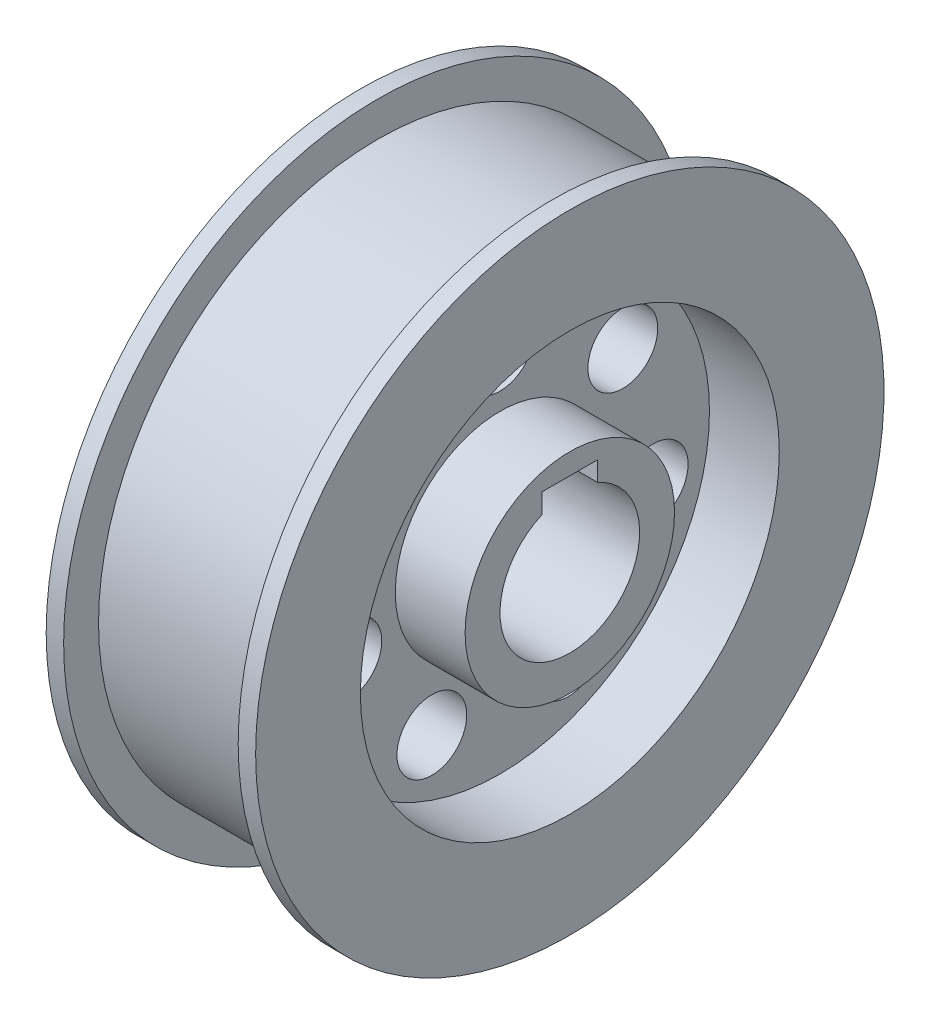
ISO-10303-21;
HEADER;
FILE_DESCRIPTION(('STEP AP214'),'2;1');
FILE_NAME('part.step','',(''),(''),'','','');
FILE_SCHEMA(('AUTOMOTIVE_DESIGN { 1 0 10303 214 1 1 1 1 }'));
ENDSEC;
DATA;
#1=APPLICATION_CONTEXT('core data for automotive mechanical design processes');
#2=APPLICATION_PROTOCOL_DEFINITION('international standard','automotive_design',2000,#1);
#3=PRODUCT_CONTEXT('',#1,'mechanical');
#4=PRODUCT('Part','Part','',(#3));
#5=PRODUCT_RELATED_PRODUCT_CATEGORY('part','',(#4));
#6=PRODUCT_DEFINITION_FORMATION('','',#4);
#7=PRODUCT_DEFINITION_CONTEXT('part definition',#1,'design');
#8=PRODUCT_DEFINITION('design','',#6,#7);
#9=PRODUCT_DEFINITION_SHAPE('','',#8);
#10=(LENGTH_UNIT() NAMED_UNIT(*) SI_UNIT(.MILLI.,.METRE.));
#11=(NAMED_UNIT(*) PLANE_ANGLE_UNIT() SI_UNIT($,.RADIAN.));
#12=(NAMED_UNIT(*) SI_UNIT($,.STERADIAN.) SOLID_ANGLE_UNIT());
#13=UNCERTAINTY_MEASURE_WITH_UNIT(LENGTH_MEASURE(1.E-05),#10,'distance_accuracy_value','');
#14=(GEOMETRIC_REPRESENTATION_CONTEXT(3) GLOBAL_UNCERTAINTY_ASSIGNED_CONTEXT((#13)) GLOBAL_UNIT_ASSIGNED_CONTEXT((#10,
#11,#12)) REPRESENTATION_CONTEXT('',''));
#15=CARTESIAN_POINT('',(0.,0.,0.));
#16=DIRECTION('',(0.,0.,1.));
#17=DIRECTION('',(1.,0.,0.));
#18=AXIS2_PLACEMENT_3D('',#15,#16,#17);
#19=CARTESIAN_POINT('',(-15.,0.,0.));
#20=DIRECTION('',(1.,0.,0.));
#21=DIRECTION('',(0.,0.,-1.));
#22=AXIS2_PLACEMENT_3D('',#19,#20,#21);
#23=CYLINDRICAL_SURFACE('',#22,15.);
#24=CARTESIAN_POINT('',(-15.,0.,0.));
#25=DIRECTION('',(1.,0.,0.));
#26=DIRECTION('',(0.,0.,-1.));
#27=AXIS2_PLACEMENT_3D('',#24,#25,#26);
#28=CIRCLE('',#27,15.);
#29=CARTESIAN_POINT('',(-15.,0.,-15.));
#30=VERTEX_POINT('',#29);
#31=EDGE_CURVE('E99',#30,#30,#28,.T.);
#32=ORIENTED_EDGE('',*,*,#31,.T.);
#33=EDGE_LOOP('',(#32));
#34=FACE_BOUND('',#33,.T.);
#35=CARTESIAN_POINT('',(-5.,0.,0.));
#36=DIRECTION('',(1.,0.,0.));
#37=DIRECTION('',(0.,0.,-1.));
#38=AXIS2_PLACEMENT_3D('',#35,#36,#37);
#39=CIRCLE('',#38,15.);
#40=CARTESIAN_POINT('',(-5.,0.,-15.));
#41=VERTEX_POINT('',#40);
#42=EDGE_CURVE('E106',#41,#41,#39,.F.);
#43=ORIENTED_EDGE('',*,*,#42,.T.);
#44=EDGE_LOOP('',(#43));
#45=FACE_BOUND('',#44,.T.);
#46=ADVANCED_FACE('F37',(#34,#45),#23,.T.);
#47=CARTESIAN_POINT('',(-15.,0.,0.));
#48=DIRECTION('',(1.,0.,0.));
#49=DIRECTION('',(0.,0.,-1.));
#50=AXIS2_PLACEMENT_3D('',#47,#48,#49);
#51=CYLINDRICAL_SURFACE('',#50,10.);
#52=CARTESIAN_POINT('',(-10.,0.,0.));
#53=DIRECTION('',(-1.,0.,0.));
#54=DIRECTION('',(0.,0.,1.));
#55=AXIS2_PLACEMENT_3D('',#52,#53,#54);
#56=CIRCLE('',#55,10.);
#57=CARTESIAN_POINT('',(-10.,9.16515138991168,4.));
#58=VERTEX_POINT('',#57);
#59=CARTESIAN_POINT('',(-10.,9.16515138991168,-4.));
#60=VERTEX_POINT('',#59);
#61=EDGE_CURVE('E54',#58,#60,#56,.F.);
#62=ORIENTED_EDGE('',*,*,#61,.F.);
#63=DIRECTION('',(1.,0.,0.));
#64=VECTOR('',#63,1.);
#65=CARTESIAN_POINT('',(-15.,9.16515138991168,4.));
#66=LINE('',#65,#64);
#67=CARTESIAN_POINT('',(15.,9.16515138991168,4.));
#68=VERTEX_POINT('',#67);
#69=EDGE_CURVE('E102',#58,#68,#66,.T.);
#70=ORIENTED_EDGE('',*,*,#69,.T.);
#71=CARTESIAN_POINT('',(15.,0.,0.));
#72=DIRECTION('',(1.,0.,0.));
#73=DIRECTION('',(0.,0.,-1.));
#74=AXIS2_PLACEMENT_3D('',#71,#72,#73);
#75=CIRCLE('',#74,10.);
#76=CARTESIAN_POINT('',(15.,9.16515138991168,-4.));
#77=VERTEX_POINT('',#76);
#78=EDGE_CURVE('E185',#68,#77,#75,.T.);
#79=ORIENTED_EDGE('',*,*,#78,.T.);
#80=DIRECTION('',(1.,0.,0.));
#81=VECTOR('',#80,1.);
#82=CARTESIAN_POINT('',(-15.,9.16515138991168,-4.));
#83=LINE('',#82,#81);
#84=EDGE_CURVE('E90',#60,#77,#83,.T.);
#85=ORIENTED_EDGE('',*,*,#84,.F.);
#86=EDGE_LOOP('',(#62,#70,#79,#85));
#87=FACE_BOUND('',#86,.T.);
#88=ADVANCED_FACE('F199',(#87),#51,.F.);
#89=CARTESIAN_POINT('',(-15.,9.16515138991168,4.));
#90=DIRECTION('',(0.,0.,1.));
#91=DIRECTION('',(1.,0.,0.));
#92=AXIS2_PLACEMENT_3D('',#89,#90,#91);
#93=PLANE('',#92);
#94=DIRECTION('',(0.,-1.,0.));
#95=VECTOR('',#94,1.);
#96=CARTESIAN_POINT('',(-10.,9.16515138991168,4.));
#97=LINE('',#96,#95);
#98=CARTESIAN_POINT('',(-10.,12.,4.));
#99=VERTEX_POINT('',#98);
#100=EDGE_CURVE('E61',#99,#58,#97,.T.);
#101=ORIENTED_EDGE('',*,*,#100,.F.);
#102=DIRECTION('',(1.,0.,0.));
#103=VECTOR('',#102,1.);
#104=CARTESIAN_POINT('',(-15.,12.,4.));
#105=LINE('',#104,#103);
#106=CARTESIAN_POINT('',(15.,12.,4.));
#107=VERTEX_POINT('',#106);
#108=EDGE_CURVE('E89',#99,#107,#105,.T.);
#109=ORIENTED_EDGE('',*,*,#108,.T.);
#110=DIRECTION('',(0.,-1.,0.));
#111=VECTOR('',#110,1.);
#112=CARTESIAN_POINT('',(15.,9.16515138991168,4.));
#113=LINE('',#112,#111);
#114=EDGE_CURVE('E191',#107,#68,#113,.T.);
#115=ORIENTED_EDGE('',*,*,#114,.T.);
#116=ORIENTED_EDGE('',*,*,#69,.F.);
#117=EDGE_LOOP('',(#101,#109,#115,#116));
#118=FACE_BOUND('',#117,.T.);
#119=ADVANCED_FACE('F203',(#118),#93,.F.);
#120=CARTESIAN_POINT('',(-15.,12.,4.));
#121=DIRECTION('',(0.,1.,0.));
#122=DIRECTION('',(0.,0.,1.));
#123=AXIS2_PLACEMENT_3D('',#120,#121,#122);
#124=PLANE('',#123);
#125=DIRECTION('',(0.,0.,1.));
#126=VECTOR('',#125,1.);
#127=CARTESIAN_POINT('',(-10.,12.,4.));
#128=LINE('',#127,#126);
#129=CARTESIAN_POINT('',(-10.,12.,-4.));
#130=VERTEX_POINT('',#129);
#131=EDGE_CURVE('E93',#130,#99,#128,.T.);
#132=ORIENTED_EDGE('',*,*,#131,.F.);
#133=DIRECTION('',(1.,0.,0.));
#134=VECTOR('',#133,1.);
#135=CARTESIAN_POINT('',(-15.,12.,-4.));
#136=LINE('',#135,#134);
#137=CARTESIAN_POINT('',(15.,12.,-4.));
#138=VERTEX_POINT('',#137);
#139=EDGE_CURVE('E80',#130,#138,#136,.T.);
#140=ORIENTED_EDGE('',*,*,#139,.T.);
#141=DIRECTION('',(0.,0.,1.));
#142=VECTOR('',#141,1.);
#143=CARTESIAN_POINT('',(15.,12.,4.));
#144=LINE('',#143,#142);
#145=EDGE_CURVE('E189',#138,#107,#144,.T.);
#146=ORIENTED_EDGE('',*,*,#145,.T.);
#147=ORIENTED_EDGE('',*,*,#108,.F.);
#148=EDGE_LOOP('',(#132,#140,#146,#147));
#149=FACE_BOUND('',#148,.T.);
#150=ADVANCED_FACE('F94',(#149),#124,.F.);
#151=CARTESIAN_POINT('',(-15.,9.16515138991168,-4.));
#152=DIRECTION('',(0.,0.,-1.));
#153=DIRECTION('',(-1.,0.,0.));
#154=AXIS2_PLACEMENT_3D('',#151,#152,#153);
#155=PLANE('',#154);
#156=DIRECTION('',(0.,1.,0.));
#157=VECTOR('',#156,1.);
#158=CARTESIAN_POINT('',(-10.,9.16515138991168,-4.));
#159=LINE('',#158,#157);
#160=EDGE_CURVE('E46',#60,#130,#159,.T.);
#161=ORIENTED_EDGE('',*,*,#160,.F.);
#162=ORIENTED_EDGE('',*,*,#84,.T.);
#163=DIRECTION('',(0.,1.,0.));
#164=VECTOR('',#163,1.);
#165=CARTESIAN_POINT('',(15.,9.16515138991168,-4.));
#166=LINE('',#165,#164);
#167=EDGE_CURVE('E85',#77,#138,#166,.T.);
#168=ORIENTED_EDGE('',*,*,#167,.T.);
#169=ORIENTED_EDGE('',*,*,#139,.F.);
#170=EDGE_LOOP('',(#161,#162,#168,#169));
#171=FACE_BOUND('',#170,.T.);
#172=ADVANCED_FACE('F82',(#171),#155,.F.);
#173=CARTESIAN_POINT('',(5.,0.,0.));
#174=DIRECTION('',(1.,0.,0.));
#175=DIRECTION('',(0.,0.,-1.));
#176=AXIS2_PLACEMENT_3D('',#173,#174,#175);
#177=CIRCLE('',#176,15.);
#178=CARTESIAN_POINT('',(5.,0.,-15.));
#179=VERTEX_POINT('',#178);
#180=EDGE_CURVE('E11',#179,#179,#177,.F.);
#181=ORIENTED_EDGE('',*,*,#180,.F.);
#182=EDGE_LOOP('',(#181));
#183=FACE_BOUND('',#182,.T.);
#184=CARTESIAN_POINT('',(15.,0.,0.));
#185=DIRECTION('',(1.,0.,0.));
#186=DIRECTION('',(0.,0.,-1.));
#187=AXIS2_PLACEMENT_3D('',#184,#185,#186);
#188=CIRCLE('',#187,15.);
#189=CARTESIAN_POINT('',(15.,0.,-15.));
#190=VERTEX_POINT('',#189);
#191=EDGE_CURVE('E194',#190,#190,#188,.T.);
#192=ORIENTED_EDGE('',*,*,#191,.F.);
#193=EDGE_LOOP('',(#192));
#194=FACE_BOUND('',#193,.T.);
#195=ADVANCED_FACE('F39',(#183,#194),#23,.T.);
#196=CARTESIAN_POINT('',(-15.,0.,0.));
#197=DIRECTION('',(1.,0.,0.));
#198=DIRECTION('',(0.,0.,-1.));
#199=AXIS2_PLACEMENT_3D('',#196,#197,#198);
#200=PLANE('',#199);
#201=ORIENTED_EDGE('',*,*,#31,.F.);
#202=EDGE_LOOP('',(#201));
#203=FACE_BOUND('',#202,.T.);
#204=CARTESIAN_POINT('',(-15.,0.,0.));
#205=DIRECTION('',(-1.,0.,0.));
#206=DIRECTION('',(0.,0.,1.));
#207=AXIS2_PLACEMENT_3D('',#204,#205,#206);
#208=CIRCLE('',#207,3.5);
#209=CARTESIAN_POINT('',(-15.,0.,3.5));
#210=VERTEX_POINT('',#209);
#211=EDGE_CURVE('E108',#210,#210,#208,.T.);
#212=ORIENTED_EDGE('',*,*,#211,.F.);
#213=EDGE_LOOP('',(#212));
#214=FACE_BOUND('',#213,.T.);
#215=ADVANCED_FACE('F219',(#203,#214),#200,.F.);
#216=CARTESIAN_POINT('',(15.,0.,0.));
#217=DIRECTION('',(1.,0.,0.));
#218=DIRECTION('',(0.,0.,-1.));
#219=AXIS2_PLACEMENT_3D('',#216,#217,#218);
#220=PLANE('',#219);
#221=ORIENTED_EDGE('',*,*,#191,.T.);
#222=EDGE_LOOP('',(#221));
#223=FACE_BOUND('',#222,.T.);
#224=ORIENTED_EDGE('',*,*,#167,.F.);
#225=ORIENTED_EDGE('',*,*,#78,.F.);
#226=ORIENTED_EDGE('',*,*,#114,.F.);
#227=ORIENTED_EDGE('',*,*,#145,.F.);
#228=EDGE_LOOP('',(#224,#225,#226,#227));
#229=FACE_BOUND('',#228,.T.);
#230=ADVANCED_FACE('F202',(#223,#229),#220,.T.);
#231=CARTESIAN_POINT('',(-10.,0.,0.));
#232=DIRECTION('',(-1.,0.,0.));
#233=DIRECTION('',(0.,0.,1.));
#234=AXIS2_PLACEMENT_3D('',#231,#232,#233);
#235=PLANE('',#234);
#236=CARTESIAN_POINT('',(-10.,0.,0.));
#237=DIRECTION('',(-1.,0.,0.));
#238=DIRECTION('',(0.,0.,1.));
#239=AXIS2_PLACEMENT_3D('',#236,#237,#238);
#240=CIRCLE('',#239,3.5);
#241=CARTESIAN_POINT('',(-10.,0.,3.5));
#242=VERTEX_POINT('',#241);
#243=EDGE_CURVE('E96',#242,#242,#240,.T.);
#244=ORIENTED_EDGE('',*,*,#243,.T.);
#245=EDGE_LOOP('',(#244));
#246=FACE_BOUND('',#245,.T.);
#247=ORIENTED_EDGE('',*,*,#100,.T.);
#248=ORIENTED_EDGE('',*,*,#61,.T.);
#249=ORIENTED_EDGE('',*,*,#160,.T.);
#250=ORIENTED_EDGE('',*,*,#131,.T.);
#251=EDGE_LOOP('',(#247,#248,#249,#250));
#252=FACE_BOUND('',#251,.T.);
#253=ADVANCED_FACE('F98',(#246,#252),#235,.F.);
#254=CARTESIAN_POINT('',(-10.,0.,0.));
#255=DIRECTION('',(-1.,0.,0.));
#256=DIRECTION('',(0.,0.,1.));
#257=AXIS2_PLACEMENT_3D('',#254,#255,#256);
#258=CYLINDRICAL_SURFACE('',#257,3.5);
#259=ORIENTED_EDGE('',*,*,#243,.F.);
#260=EDGE_LOOP('',(#259));
#261=FACE_BOUND('',#260,.T.);
#262=ORIENTED_EDGE('',*,*,#211,.T.);
#263=EDGE_LOOP('',(#262));
#264=FACE_BOUND('',#263,.T.);
#265=ADVANCED_FACE('F235',(#261,#264),#258,.F.);
#266=CARTESIAN_POINT('',(-5.,0.,0.));
#267=DIRECTION('',(1.,0.,0.));
#268=DIRECTION('',(0.,0.,-1.));
#269=AXIS2_PLACEMENT_3D('',#266,#267,#268);
#270=PLANE('',#269);
#271=ORIENTED_EDGE('',*,*,#42,.F.);
#272=EDGE_LOOP('',(#271));
#273=FACE_BOUND('',#272,.T.);
#274=CARTESIAN_POINT('',(-5.,14.0285205418187,17.5912083555293));
#275=DIRECTION('',(1.,0.,0.));
#276=DIRECTION('',(0.,0.,-1.));
#277=AXIS2_PLACEMENT_3D('',#274,#275,#276);
#278=CIRCLE('',#277,5.);
#279=CARTESIAN_POINT('',(-5.,14.0285205418187,12.5912083555293));
#280=VERTEX_POINT('',#279);
#281=EDGE_CURVE('E156',#280,#280,#278,.T.);
#282=ORIENTED_EDGE('',*,*,#281,.T.);
#283=EDGE_LOOP('',(#282));
#284=FACE_BOUND('',#283,.T.);
#285=CARTESIAN_POINT('',(-5.,-5.00672101402053,21.9358780240867));
#286=DIRECTION('',(1.,0.,0.));
#287=DIRECTION('',(0.,0.,-1.));
#288=AXIS2_PLACEMENT_3D('',#285,#286,#287);
#289=CIRCLE('',#288,5.);
#290=CARTESIAN_POINT('',(-5.,-5.00672101402053,16.9358780240867));
#291=VERTEX_POINT('',#290);
#292=EDGE_CURVE('E159',#291,#291,#289,.T.);
#293=ORIENTED_EDGE('',*,*,#292,.T.);
#294=EDGE_LOOP('',(#293));
#295=FACE_BOUND('',#294,.T.);
#296=CARTESIAN_POINT('',(-5.,-20.271799527806,9.76238413013832));
#297=DIRECTION('',(1.,0.,0.));
#298=DIRECTION('',(0.,0.,-1.));
#299=AXIS2_PLACEMENT_3D('',#296,#297,#298);
#300=CIRCLE('',#299,5.);
#301=CARTESIAN_POINT('',(-5.,-20.271799527806,4.76238413013832));
#302=VERTEX_POINT('',#301);
#303=EDGE_CURVE('E162',#302,#302,#300,.T.);
#304=ORIENTED_EDGE('',*,*,#303,.T.);
#305=EDGE_LOOP('',(#304));
#306=FACE_BOUND('',#305,.T.);
#307=CARTESIAN_POINT('',(-5.,-20.2717995278029,-9.76238413015179));
#308=DIRECTION('',(1.,0.,0.));
#309=DIRECTION('',(0.,0.,-1.));
#310=AXIS2_PLACEMENT_3D('',#307,#308,#309);
#311=CIRCLE('',#310,5.);
#312=CARTESIAN_POINT('',(-5.,-20.2717995278029,-14.7623841301518));
#313=VERTEX_POINT('',#312);
#314=EDGE_CURVE('E165',#313,#313,#311,.T.);
#315=ORIENTED_EDGE('',*,*,#314,.T.);
#316=EDGE_LOOP('',(#315));
#317=FACE_BOUND('',#316,.T.);
#318=CARTESIAN_POINT('',(-5.,-5.00672101401362,-21.9358780240954));
#319=DIRECTION('',(1.,0.,0.));
#320=DIRECTION('',(0.,0.,-1.));
#321=AXIS2_PLACEMENT_3D('',#318,#319,#320);
#322=CIRCLE('',#321,5.);
#323=CARTESIAN_POINT('',(-5.,-5.00672101401362,-26.9358780240954));
#324=VERTEX_POINT('',#323);
#325=EDGE_CURVE('E168',#324,#324,#322,.T.);
#326=ORIENTED_EDGE('',*,*,#325,.T.);
#327=EDGE_LOOP('',(#326));
#328=FACE_BOUND('',#327,.T.);
#329=CARTESIAN_POINT('',(-5.,14.0285205418243,-17.591208355532));
#330=DIRECTION('',(1.,0.,0.));
#331=DIRECTION('',(0.,0.,-1.));
#332=AXIS2_PLACEMENT_3D('',#329,#330,#331);
#333=CIRCLE('',#332,5.);
#334=CARTESIAN_POINT('',(-5.,14.0285205418243,-22.591208355532));
#335=VERTEX_POINT('',#334);
#336=EDGE_CURVE('E171',#335,#335,#333,.T.);
#337=ORIENTED_EDGE('',*,*,#336,.T.);
#338=EDGE_LOOP('',(#337));
#339=FACE_BOUND('',#338,.T.);
#340=CARTESIAN_POINT('',(-5.,22.5,0.));
#341=DIRECTION('',(1.,0.,0.));
#342=DIRECTION('',(0.,0.,-1.));
#343=AXIS2_PLACEMENT_3D('',#340,#341,#342);
#344=CIRCLE('',#343,5.);
#345=CARTESIAN_POINT('',(-5.,22.5,-5.));
#346=VERTEX_POINT('',#345);
#347=EDGE_CURVE('E174',#346,#346,#344,.T.);
#348=ORIENTED_EDGE('',*,*,#347,.T.);
#349=EDGE_LOOP('',(#348));
#350=FACE_BOUND('',#349,.T.);
#351=CARTESIAN_POINT('',(-5.,0.,0.));
#352=DIRECTION('',(1.,0.,0.));
#353=DIRECTION('',(0.,0.,-1.));
#354=AXIS2_PLACEMENT_3D('',#351,#352,#353);
#355=CIRCLE('',#354,30.);
#356=CARTESIAN_POINT('',(-5.,0.,-30.));
#357=VERTEX_POINT('',#356);
#358=EDGE_CURVE('E109',#357,#357,#355,.T.);
#359=ORIENTED_EDGE('',*,*,#358,.F.);
#360=EDGE_LOOP('',(#359));
#361=FACE_BOUND('',#360,.T.);
#362=ADVANCED_FACE('F241',(#273,#284,#295,#306,#317,#328,#339,#350,#361),#270,.F.);
#363=CARTESIAN_POINT('',(-5.,22.5,0.));
#364=DIRECTION('',(1.,0.,0.));
#365=DIRECTION('',(0.,0.,-1.));
#366=AXIS2_PLACEMENT_3D('',#363,#364,#365);
#367=CYLINDRICAL_SURFACE('',#366,5.);
#368=ORIENTED_EDGE('',*,*,#347,.F.);
#369=EDGE_LOOP('',(#368));
#370=FACE_BOUND('',#369,.T.);
#371=CARTESIAN_POINT('',(5.,22.5,0.));
#372=DIRECTION('',(1.,0.,0.));
#373=DIRECTION('',(0.,0.,-1.));
#374=AXIS2_PLACEMENT_3D('',#371,#372,#373);
#375=CIRCLE('',#374,5.);
#376=CARTESIAN_POINT('',(5.,22.5,-5.));
#377=VERTEX_POINT('',#376);
#378=EDGE_CURVE('E153',#377,#377,#375,.T.);
#379=ORIENTED_EDGE('',*,*,#378,.T.);
#380=EDGE_LOOP('',(#379));
#381=FACE_BOUND('',#380,.T.);
#382=ADVANCED_FACE('F245',(#370,#381),#367,.F.);
#383=CARTESIAN_POINT('',(-5.,14.0285205418243,-17.591208355532));
#384=DIRECTION('',(1.,0.,0.));
#385=DIRECTION('',(0.,0.,-1.));
#386=AXIS2_PLACEMENT_3D('',#383,#384,#385);
#387=CYLINDRICAL_SURFACE('',#386,5.);
#388=ORIENTED_EDGE('',*,*,#336,.F.);
#389=EDGE_LOOP('',(#388));
#390=FACE_BOUND('',#389,.T.);
#391=CARTESIAN_POINT('',(5.,14.0285205418243,-17.591208355532));
#392=DIRECTION('',(1.,0.,0.));
#393=DIRECTION('',(0.,0.,-1.));
#394=AXIS2_PLACEMENT_3D('',#391,#392,#393);
#395=CIRCLE('',#394,5.);
#396=CARTESIAN_POINT('',(5.,14.0285205418243,-22.591208355532));
#397=VERTEX_POINT('',#396);
#398=EDGE_CURVE('E150',#397,#397,#395,.T.);
#399=ORIENTED_EDGE('',*,*,#398,.T.);
#400=EDGE_LOOP('',(#399));
#401=FACE_BOUND('',#400,.T.);
#402=ADVANCED_FACE('F249',(#390,#401),#387,.F.);
#403=CARTESIAN_POINT('',(-5.,-5.00672101401362,-21.9358780240954));
#404=DIRECTION('',(1.,0.,0.));
#405=DIRECTION('',(0.,0.,-1.));
#406=AXIS2_PLACEMENT_3D('',#403,#404,#405);
#407=CYLINDRICAL_SURFACE('',#406,5.);
#408=ORIENTED_EDGE('',*,*,#325,.F.);
#409=EDGE_LOOP('',(#408));
#410=FACE_BOUND('',#409,.T.);
#411=CARTESIAN_POINT('',(5.,-5.00672101401362,-21.9358780240954));
#412=DIRECTION('',(1.,0.,0.));
#413=DIRECTION('',(0.,0.,-1.));
#414=AXIS2_PLACEMENT_3D('',#411,#412,#413);
#415=CIRCLE('',#414,5.);
#416=CARTESIAN_POINT('',(5.,-5.00672101401362,-26.9358780240954));
#417=VERTEX_POINT('',#416);
#418=EDGE_CURVE('E147',#417,#417,#415,.T.);
#419=ORIENTED_EDGE('',*,*,#418,.T.);
#420=EDGE_LOOP('',(#419));
#421=FACE_BOUND('',#420,.T.);
#422=ADVANCED_FACE('F253',(#410,#421),#407,.F.);
#423=CARTESIAN_POINT('',(-5.,-20.2717995278029,-9.76238413015179));
#424=DIRECTION('',(1.,0.,0.));
#425=DIRECTION('',(0.,0.,-1.));
#426=AXIS2_PLACEMENT_3D('',#423,#424,#425);
#427=CYLINDRICAL_SURFACE('',#426,5.);
#428=ORIENTED_EDGE('',*,*,#314,.F.);
#429=EDGE_LOOP('',(#428));
#430=FACE_BOUND('',#429,.T.);
#431=CARTESIAN_POINT('',(5.,-20.2717995278029,-9.76238413015179));
#432=DIRECTION('',(1.,0.,0.));
#433=DIRECTION('',(0.,0.,-1.));
#434=AXIS2_PLACEMENT_3D('',#431,#432,#433);
#435=CIRCLE('',#434,5.);
#436=CARTESIAN_POINT('',(5.,-20.2717995278029,-14.7623841301518));
#437=VERTEX_POINT('',#436);
#438=EDGE_CURVE('E144',#437,#437,#435,.T.);
#439=ORIENTED_EDGE('',*,*,#438,.T.);
#440=EDGE_LOOP('',(#439));
#441=FACE_BOUND('',#440,.T.);
#442=ADVANCED_FACE('F257',(#430,#441),#427,.F.);
#443=CARTESIAN_POINT('',(-5.,-20.271799527806,9.76238413013832));
#444=DIRECTION('',(1.,0.,0.));
#445=DIRECTION('',(0.,0.,-1.));
#446=AXIS2_PLACEMENT_3D('',#443,#444,#445);
#447=CYLINDRICAL_SURFACE('',#446,5.);
#448=ORIENTED_EDGE('',*,*,#303,.F.);
#449=EDGE_LOOP('',(#448));
#450=FACE_BOUND('',#449,.T.);
#451=CARTESIAN_POINT('',(5.,-20.271799527806,9.76238413013832));
#452=DIRECTION('',(1.,0.,0.));
#453=DIRECTION('',(0.,0.,-1.));
#454=AXIS2_PLACEMENT_3D('',#451,#452,#453);
#455=CIRCLE('',#454,5.);
#456=CARTESIAN_POINT('',(5.,-20.271799527806,4.76238413013832));
#457=VERTEX_POINT('',#456);
#458=EDGE_CURVE('E141',#457,#457,#455,.T.);
#459=ORIENTED_EDGE('',*,*,#458,.T.);
#460=EDGE_LOOP('',(#459));
#461=FACE_BOUND('',#460,.T.);
#462=ADVANCED_FACE('F261',(#450,#461),#447,.F.);
#463=CARTESIAN_POINT('',(-5.,-5.00672101402053,21.9358780240867));
#464=DIRECTION('',(1.,0.,0.));
#465=DIRECTION('',(0.,0.,-1.));
#466=AXIS2_PLACEMENT_3D('',#463,#464,#465);
#467=CYLINDRICAL_SURFACE('',#466,5.);
#468=ORIENTED_EDGE('',*,*,#292,.F.);
#469=EDGE_LOOP('',(#468));
#470=FACE_BOUND('',#469,.T.);
#471=CARTESIAN_POINT('',(5.,-5.00672101402053,21.9358780240867));
#472=DIRECTION('',(1.,0.,0.));
#473=DIRECTION('',(0.,0.,-1.));
#474=AXIS2_PLACEMENT_3D('',#471,#472,#473);
#475=CIRCLE('',#474,5.);
#476=CARTESIAN_POINT('',(5.,-5.00672101402053,16.9358780240867));
#477=VERTEX_POINT('',#476);
#478=EDGE_CURVE('E138',#477,#477,#475,.T.);
#479=ORIENTED_EDGE('',*,*,#478,.T.);
#480=EDGE_LOOP('',(#479));
#481=FACE_BOUND('',#480,.T.);
#482=ADVANCED_FACE('F265',(#470,#481),#467,.F.);
#483=CARTESIAN_POINT('',(-5.,14.0285205418187,17.5912083555293));
#484=DIRECTION('',(1.,0.,0.));
#485=DIRECTION('',(0.,0.,-1.));
#486=AXIS2_PLACEMENT_3D('',#483,#484,#485);
#487=CYLINDRICAL_SURFACE('',#486,5.);
#488=ORIENTED_EDGE('',*,*,#281,.F.);
#489=EDGE_LOOP('',(#488));
#490=FACE_BOUND('',#489,.T.);
#491=CARTESIAN_POINT('',(5.,14.0285205418187,17.5912083555293));
#492=DIRECTION('',(1.,0.,0.));
#493=DIRECTION('',(0.,0.,-1.));
#494=AXIS2_PLACEMENT_3D('',#491,#492,#493);
#495=CIRCLE('',#494,5.);
#496=CARTESIAN_POINT('',(5.,14.0285205418187,12.5912083555293));
#497=VERTEX_POINT('',#496);
#498=EDGE_CURVE('E135',#497,#497,#495,.T.);
#499=ORIENTED_EDGE('',*,*,#498,.T.);
#500=EDGE_LOOP('',(#499));
#501=FACE_BOUND('',#500,.T.);
#502=ADVANCED_FACE('F269',(#490,#501),#487,.F.);
#503=CARTESIAN_POINT('',(5.,0.,0.));
#504=DIRECTION('',(1.,0.,0.));
#505=DIRECTION('',(0.,0.,-1.));
#506=AXIS2_PLACEMENT_3D('',#503,#504,#505);
#507=PLANE('',#506);
#508=ORIENTED_EDGE('',*,*,#180,.T.);
#509=EDGE_LOOP('',(#508));
#510=FACE_BOUND('',#509,.T.);
#511=ORIENTED_EDGE('',*,*,#478,.F.);
#512=EDGE_LOOP('',(#511));
#513=FACE_BOUND('',#512,.T.);
#514=ORIENTED_EDGE('',*,*,#438,.F.);
#515=EDGE_LOOP('',(#514));
#516=FACE_BOUND('',#515,.T.);
#517=ORIENTED_EDGE('',*,*,#398,.F.);
#518=EDGE_LOOP('',(#517));
#519=FACE_BOUND('',#518,.T.);
#520=ORIENTED_EDGE('',*,*,#378,.F.);
#521=EDGE_LOOP('',(#520));
#522=FACE_BOUND('',#521,.T.);
#523=CARTESIAN_POINT('',(5.,0.,0.));
#524=DIRECTION('',(1.,0.,0.));
#525=DIRECTION('',(0.,0.,-1.));
#526=AXIS2_PLACEMENT_3D('',#523,#524,#525);
#527=CIRCLE('',#526,30.);
#528=CARTESIAN_POINT('',(5.,0.,-30.));
#529=VERTEX_POINT('',#528);
#530=EDGE_CURVE('E132',#529,#529,#527,.T.);
#531=ORIENTED_EDGE('',*,*,#530,.T.);
#532=EDGE_LOOP('',(#531));
#533=FACE_BOUND('',#532,.T.);
#534=ORIENTED_EDGE('',*,*,#418,.F.);
#535=EDGE_LOOP('',(#534));
#536=FACE_BOUND('',#535,.T.);
#537=ORIENTED_EDGE('',*,*,#458,.F.);
#538=EDGE_LOOP('',(#537));
#539=FACE_BOUND('',#538,.T.);
#540=ORIENTED_EDGE('',*,*,#498,.F.);
#541=EDGE_LOOP('',(#540));
#542=FACE_BOUND('',#541,.T.);
#543=ADVANCED_FACE('F273',(#510,#513,#516,#519,#522,#533,#536,#539,#542),#507,.T.);
#544=CARTESIAN_POINT('',(-15.,0.,0.));
#545=DIRECTION('',(1.,0.,0.));
#546=DIRECTION('',(0.,0.,-1.));
#547=AXIS2_PLACEMENT_3D('',#544,#545,#546);
#548=CYLINDRICAL_SURFACE('',#547,30.);
#549=CARTESIAN_POINT('',(-15.,0.,0.));
#550=DIRECTION('',(1.,0.,0.));
#551=DIRECTION('',(0.,0.,-1.));
#552=AXIS2_PLACEMENT_3D('',#549,#550,#551);
#553=CIRCLE('',#552,30.);
#554=CARTESIAN_POINT('',(-15.,0.,-30.));
#555=VERTEX_POINT('',#554);
#556=EDGE_CURVE('E129',#555,#555,#553,.T.);
#557=ORIENTED_EDGE('',*,*,#556,.F.);
#558=EDGE_LOOP('',(#557));
#559=FACE_BOUND('',#558,.T.);
#560=ORIENTED_EDGE('',*,*,#358,.T.);
#561=EDGE_LOOP('',(#560));
#562=FACE_BOUND('',#561,.T.);
#563=ADVANCED_FACE('F277',(#559,#562),#548,.F.);
#564=CARTESIAN_POINT('',(-15.,0.,0.));
#565=DIRECTION('',(1.,0.,0.));
#566=DIRECTION('',(0.,0.,-1.));
#567=AXIS2_PLACEMENT_3D('',#564,#565,#566);
#568=PLANE('',#567);
#569=ORIENTED_EDGE('',*,*,#556,.T.);
#570=EDGE_LOOP('',(#569));
#571=FACE_BOUND('',#570,.T.);
#572=CARTESIAN_POINT('',(-15.,0.,0.));
#573=DIRECTION('',(-1.,0.,0.));
#574=DIRECTION('',(0.,0.,1.));
#575=AXIS2_PLACEMENT_3D('',#572,#573,#574);
#576=CIRCLE('',#575,45.);
#577=CARTESIAN_POINT('',(-15.,0.,45.));
#578=VERTEX_POINT('',#577);
#579=EDGE_CURVE('E112',#578,#578,#576,.T.);
#580=ORIENTED_EDGE('',*,*,#579,.T.);
#581=EDGE_LOOP('',(#580));
#582=FACE_BOUND('',#581,.T.);
#583=ADVANCED_FACE('F284',(#571,#582),#568,.F.);
#584=ORIENTED_EDGE('',*,*,#530,.F.);
#585=EDGE_LOOP('',(#584));
#586=FACE_BOUND('',#585,.T.);
#587=CARTESIAN_POINT('',(15.,0.,0.));
#588=DIRECTION('',(1.,0.,0.));
#589=DIRECTION('',(0.,0.,-1.));
#590=AXIS2_PLACEMENT_3D('',#587,#588,#589);
#591=CIRCLE('',#590,30.);
#592=CARTESIAN_POINT('',(15.,0.,-30.));
#593=VERTEX_POINT('',#592);
#594=EDGE_CURVE('E116',#593,#593,#591,.T.);
#595=ORIENTED_EDGE('',*,*,#594,.T.);
#596=EDGE_LOOP('',(#595));
#597=FACE_BOUND('',#596,.T.);
#598=ADVANCED_FACE('F287',(#586,#597),#548,.F.);
#599=CARTESIAN_POINT('',(15.,0.,0.));
#600=DIRECTION('',(1.,0.,0.));
#601=DIRECTION('',(0.,0.,-1.));
#602=AXIS2_PLACEMENT_3D('',#599,#600,#601);
#603=PLANE('',#602);
#604=ORIENTED_EDGE('',*,*,#594,.F.);
#605=EDGE_LOOP('',(#604));
#606=FACE_BOUND('',#605,.T.);
#607=CARTESIAN_POINT('',(15.,0.,0.));
#608=DIRECTION('',(-1.,0.,0.));
#609=DIRECTION('',(0.,0.,1.));
#610=AXIS2_PLACEMENT_3D('',#607,#608,#609);
#611=CIRCLE('',#610,45.);
#612=CARTESIAN_POINT('',(15.,0.,45.));
#613=VERTEX_POINT('',#612);
#614=EDGE_CURVE('E316',#613,#613,#611,.T.);
#615=ORIENTED_EDGE('',*,*,#614,.F.);
#616=EDGE_LOOP('',(#615));
#617=FACE_BOUND('',#616,.T.);
#618=ADVANCED_FACE('F291',(#606,#617),#603,.T.);
#619=CARTESIAN_POINT('',(12.5,37.,0.));
#620=DIRECTION('',(1.,0.,0.));
#621=DIRECTION('',(0.,0.,-1.));
#622=AXIS2_PLACEMENT_3D('',#619,#620,#621);
#623=PLANE('',#622);
#624=CARTESIAN_POINT('',(12.5,0.,0.));
#625=DIRECTION('',(1.,0.,0.));
#626=DIRECTION('',(0.,0.,-1.));
#627=AXIS2_PLACEMENT_3D('',#624,#625,#626);
#628=CIRCLE('',#627,40.);
#629=CARTESIAN_POINT('',(12.5,0.,-40.));
#630=VERTEX_POINT('',#629);
#631=EDGE_CURVE('E110',#630,#630,#628,.F.);
#632=ORIENTED_EDGE('',*,*,#631,.F.);
#633=EDGE_LOOP('',(#632));
#634=FACE_BOUND('',#633,.T.);
#635=CARTESIAN_POINT('',(12.5,0.,0.));
#636=DIRECTION('',(-1.,0.,0.));
#637=DIRECTION('',(0.,0.,1.));
#638=AXIS2_PLACEMENT_3D('',#635,#636,#637);
#639=CIRCLE('',#638,45.);
#640=CARTESIAN_POINT('',(12.5,0.,45.));
#641=VERTEX_POINT('',#640);
#642=EDGE_CURVE('E123',#641,#641,#639,.T.);
#643=ORIENTED_EDGE('',*,*,#642,.T.);
#644=EDGE_LOOP('',(#643));
#645=FACE_BOUND('',#644,.T.);
#646=ADVANCED_FACE('F295',(#634,#645),#623,.F.);
#647=CARTESIAN_POINT('',(0.,0.,0.));
#648=DIRECTION('',(-1.,0.,0.));
#649=DIRECTION('',(0.,0.,1.));
#650=AXIS2_PLACEMENT_3D('',#647,#648,#649);
#651=CYLINDRICAL_SURFACE('',#650,45.);
#652=ORIENTED_EDGE('',*,*,#642,.F.);
#653=EDGE_LOOP('',(#652));
#654=FACE_BOUND('',#653,.T.);
#655=ORIENTED_EDGE('',*,*,#614,.T.);
#656=EDGE_LOOP('',(#655));
#657=FACE_BOUND('',#656,.T.);
#658=ADVANCED_FACE('F283',(#654,#657),#651,.T.);
#659=CARTESIAN_POINT('',(-15.,0.,0.));
#660=DIRECTION('',(1.,0.,0.));
#661=DIRECTION('',(0.,0.,-1.));
#662=AXIS2_PLACEMENT_3D('',#659,#660,#661);
#663=CYLINDRICAL_SURFACE('',#662,40.);
#664=ORIENTED_EDGE('',*,*,#631,.T.);
#665=EDGE_LOOP('',(#664));
#666=FACE_BOUND('',#665,.T.);
#667=CARTESIAN_POINT('',(-12.5,0.,0.));
#668=DIRECTION('',(-1.,0.,0.));
#669=DIRECTION('',(0.,0.,1.));
#670=AXIS2_PLACEMENT_3D('',#667,#668,#669);
#671=CIRCLE('',#670,40.);
#672=CARTESIAN_POINT('',(-12.5,0.,40.));
#673=VERTEX_POINT('',#672);
#674=EDGE_CURVE('E41',#673,#673,#671,.F.);
#675=ORIENTED_EDGE('',*,*,#674,.T.);
#676=EDGE_LOOP('',(#675));
#677=FACE_BOUND('',#676,.T.);
#678=ADVANCED_FACE('F279',(#666,#677),#663,.T.);
#679=CARTESIAN_POINT('',(0.,0.,0.));
#680=DIRECTION('',(-1.,0.,0.));
#681=DIRECTION('',(0.,0.,1.));
#682=AXIS2_PLACEMENT_3D('',#679,#680,#681);
#683=CYLINDRICAL_SURFACE('',#682,45.);
#684=ORIENTED_EDGE('',*,*,#579,.F.);
#685=EDGE_LOOP('',(#684));
#686=FACE_BOUND('',#685,.T.);
#687=CARTESIAN_POINT('',(-12.5,0.,0.));
#688=DIRECTION('',(-1.,0.,0.));
#689=DIRECTION('',(0.,0.,1.));
#690=AXIS2_PLACEMENT_3D('',#687,#688,#689);
#691=CIRCLE('',#690,45.);
#692=CARTESIAN_POINT('',(-12.5,0.,45.));
#693=VERTEX_POINT('',#692);
#694=EDGE_CURVE('E118',#693,#693,#691,.T.);
#695=ORIENTED_EDGE('',*,*,#694,.T.);
#696=EDGE_LOOP('',(#695));
#697=FACE_BOUND('',#696,.T.);
#698=ADVANCED_FACE('F282',(#686,#697),#683,.T.);
#699=CARTESIAN_POINT('',(-12.5,45.,0.));
#700=DIRECTION('',(-1.,0.,0.));
#701=DIRECTION('',(0.,0.,1.));
#702=AXIS2_PLACEMENT_3D('',#699,#700,#701);
#703=PLANE('',#702);
#704=ORIENTED_EDGE('',*,*,#674,.F.);
#705=EDGE_LOOP('',(#704));
#706=FACE_BOUND('',#705,.T.);
#707=ORIENTED_EDGE('',*,*,#694,.F.);
#708=EDGE_LOOP('',(#707));
#709=FACE_BOUND('',#708,.T.);
#710=ADVANCED_FACE('F299',(#706,#709),#703,.F.);
#711=CLOSED_SHELL('',(#46,#88,#119,#150,#172,#195,#215,#230,#253,#265,#362,#382,#402,#422,#442,
#462,#482,#502,#543,#563,#583,#598,#618,#646,#658,#678,#698,#710));
#712=MANIFOLD_SOLID_BREP('B2',#711);
#713=ADVANCED_BREP_SHAPE_REPRESENTATION('',(#18,#712),#14);
#714=SHAPE_DEFINITION_REPRESENTATION(#9,#713);
ENDSEC;
END-ISO-10303-21;
